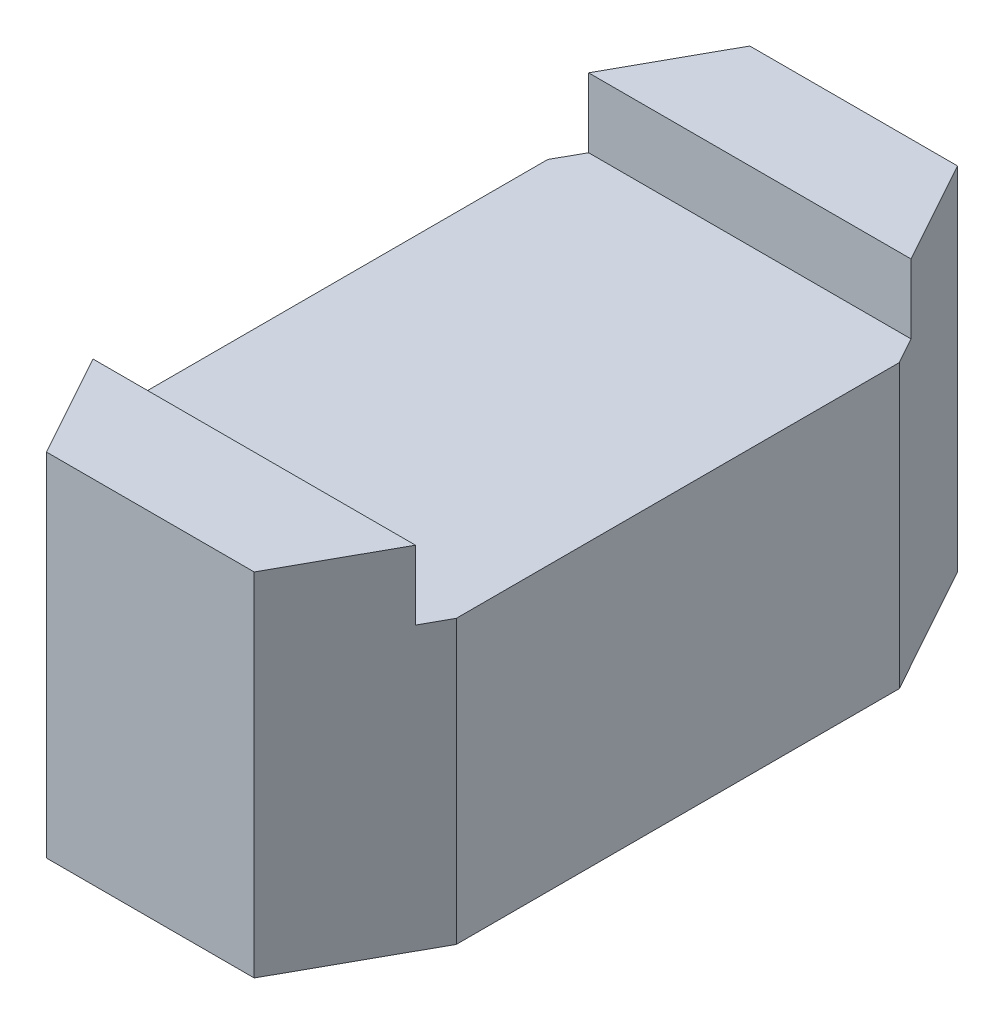
ISO-10303-21;
HEADER;
FILE_DESCRIPTION(('STEP AP214'),'2;1');
FILE_NAME('part.step','',(''),(''),'','','');
FILE_SCHEMA(('AUTOMOTIVE_DESIGN { 1 0 10303 214 1 1 1 1 }'));
ENDSEC;
DATA;
#1=APPLICATION_CONTEXT('core data for automotive mechanical design processes');
#2=APPLICATION_PROTOCOL_DEFINITION('international standard','automotive_design',2000,#1);
#3=PRODUCT_CONTEXT('',#1,'mechanical');
#4=PRODUCT('Part','Part','',(#3));
#5=PRODUCT_RELATED_PRODUCT_CATEGORY('part','',(#4));
#6=PRODUCT_DEFINITION_FORMATION('','',#4);
#7=PRODUCT_DEFINITION_CONTEXT('part definition',#1,'design');
#8=PRODUCT_DEFINITION('design','',#6,#7);
#9=PRODUCT_DEFINITION_SHAPE('','',#8);
#10=(LENGTH_UNIT() NAMED_UNIT(*) SI_UNIT(.MILLI.,.METRE.));
#11=(NAMED_UNIT(*) PLANE_ANGLE_UNIT() SI_UNIT($,.RADIAN.));
#12=(NAMED_UNIT(*) SI_UNIT($,.STERADIAN.) SOLID_ANGLE_UNIT());
#13=UNCERTAINTY_MEASURE_WITH_UNIT(LENGTH_MEASURE(1.E-05),#10,'distance_accuracy_value','');
#14=(GEOMETRIC_REPRESENTATION_CONTEXT(3) GLOBAL_UNCERTAINTY_ASSIGNED_CONTEXT((#13)) GLOBAL_UNIT_ASSIGNED_CONTEXT((#10,
#11,#12)) REPRESENTATION_CONTEXT('',''));
#15=CARTESIAN_POINT('',(0.,0.,0.));
#16=DIRECTION('',(0.,0.,1.));
#17=DIRECTION('',(1.,0.,0.));
#18=AXIS2_PLACEMENT_3D('',#15,#16,#17);
#19=CARTESIAN_POINT('',(-1.27,2.54,-1.6));
#20=DIRECTION('',(1.,0.,0.));
#21=DIRECTION('',(0.,0.,-1.));
#22=AXIS2_PLACEMENT_3D('',#19,#20,#21);
#23=PLANE('',#22);
#24=DIRECTION('',(0.,0.,1.));
#25=VECTOR('',#24,1.);
#26=CARTESIAN_POINT('',(-1.27,2.04,-1.79));
#27=LINE('',#26,#25);
#28=CARTESIAN_POINT('',(-1.27,2.04,-1.6));
#29=VERTEX_POINT('',#28);
#30=CARTESIAN_POINT('',(-1.27,2.04,1.6));
#31=VERTEX_POINT('',#30);
#32=EDGE_CURVE('E234',#29,#31,#27,.T.);
#33=ORIENTED_EDGE('',*,*,#32,.F.);
#34=DIRECTION('',(0.,-1.,0.));
#35=VECTOR('',#34,1.);
#36=CARTESIAN_POINT('',(-1.27,2.54,-1.6));
#37=LINE('',#36,#35);
#38=CARTESIAN_POINT('',(-1.27,0.,-1.6));
#39=VERTEX_POINT('',#38);
#40=EDGE_CURVE('E185',#29,#39,#37,.T.);
#41=ORIENTED_EDGE('',*,*,#40,.T.);
#42=DIRECTION('',(0.,0.,1.));
#43=VECTOR('',#42,1.);
#44=CARTESIAN_POINT('',(-1.27,0.,-1.6));
#45=LINE('',#44,#43);
#46=CARTESIAN_POINT('',(-1.27,0.,1.6));
#47=VERTEX_POINT('',#46);
#48=EDGE_CURVE('E165',#39,#47,#45,.T.);
#49=ORIENTED_EDGE('',*,*,#48,.T.);
#50=DIRECTION('',(0.,-1.,0.));
#51=VECTOR('',#50,1.);
#52=CARTESIAN_POINT('',(-1.27,2.54,1.6));
#53=LINE('',#52,#51);
#54=EDGE_CURVE('E183',#31,#47,#53,.T.);
#55=ORIENTED_EDGE('',*,*,#54,.F.);
#56=EDGE_LOOP('',(#33,#41,#49,#55));
#57=FACE_BOUND('',#56,.T.);
#58=ADVANCED_FACE('F35',(#57),#23,.F.);
#59=CARTESIAN_POINT('',(1.27,2.54,-1.6));
#60=DIRECTION('',(-1.,0.,0.));
#61=DIRECTION('',(0.,0.,1.));
#62=AXIS2_PLACEMENT_3D('',#59,#60,#61);
#63=PLANE('',#62);
#64=DIRECTION('',(0.,0.,-1.));
#65=VECTOR('',#64,1.);
#66=CARTESIAN_POINT('',(1.27,2.04,-1.79));
#67=LINE('',#66,#65);
#68=CARTESIAN_POINT('',(1.27,2.04,1.6));
#69=VERTEX_POINT('',#68);
#70=CARTESIAN_POINT('',(1.27,2.04,-1.6));
#71=VERTEX_POINT('',#70);
#72=EDGE_CURVE('E230',#69,#71,#67,.T.);
#73=ORIENTED_EDGE('',*,*,#72,.F.);
#74=DIRECTION('',(0.,-1.,0.));
#75=VECTOR('',#74,1.);
#76=CARTESIAN_POINT('',(1.27,2.54,1.6));
#77=LINE('',#76,#75);
#78=CARTESIAN_POINT('',(1.27,0.,1.6));
#79=VERTEX_POINT('',#78);
#80=EDGE_CURVE('E151',#69,#79,#77,.T.);
#81=ORIENTED_EDGE('',*,*,#80,.T.);
#82=DIRECTION('',(0.,0.,-1.));
#83=VECTOR('',#82,1.);
#84=CARTESIAN_POINT('',(1.27,0.,-1.6));
#85=LINE('',#84,#83);
#86=CARTESIAN_POINT('',(1.27,0.,-1.6));
#87=VERTEX_POINT('',#86);
#88=EDGE_CURVE('E175',#79,#87,#85,.T.);
#89=ORIENTED_EDGE('',*,*,#88,.T.);
#90=DIRECTION('',(0.,-1.,0.));
#91=VECTOR('',#90,1.);
#92=CARTESIAN_POINT('',(1.27,2.54,-1.6));
#93=LINE('',#92,#91);
#94=EDGE_CURVE('E93',#71,#87,#93,.T.);
#95=ORIENTED_EDGE('',*,*,#94,.F.);
#96=EDGE_LOOP('',(#73,#81,#89,#95));
#97=FACE_BOUND('',#96,.T.);
#98=ADVANCED_FACE('F249',(#97),#63,.F.);
#99=CARTESIAN_POINT('',(0.,2.54,0.));
#100=DIRECTION('',(0.,1.,0.));
#101=DIRECTION('',(0.,0.,1.));
#102=AXIS2_PLACEMENT_3D('',#99,#100,#101);
#103=PLANE('',#102);
#104=DIRECTION('',(-1.,0.,0.));
#105=VECTOR('',#104,1.);
#106=CARTESIAN_POINT('',(0.,2.54,-1.79));
#107=LINE('',#106,#105);
#108=CARTESIAN_POINT('',(1.16489361702128,2.54,-1.79));
#109=VERTEX_POINT('',#108);
#110=CARTESIAN_POINT('',(-1.16489361702128,2.54,-1.79));
#111=VERTEX_POINT('',#110);
#112=EDGE_CURVE('E11',#109,#111,#107,.T.);
#113=ORIENTED_EDGE('',*,*,#112,.F.);
#114=DIRECTION('',(-0.484061385167266,0.,-0.87503404241775));
#115=VECTOR('',#114,1.);
#116=CARTESIAN_POINT('',(0.75,2.54,-2.54));
#117=LINE('',#116,#115);
#118=CARTESIAN_POINT('',(0.75,2.54,-2.54));
#119=VERTEX_POINT('',#118);
#120=EDGE_CURVE('E101',#109,#119,#117,.T.);
#121=ORIENTED_EDGE('',*,*,#120,.T.);
#122=DIRECTION('',(-1.,0.,0.));
#123=VECTOR('',#122,1.);
#124=CARTESIAN_POINT('',(-0.75,2.54,-2.54));
#125=LINE('',#124,#123);
#126=CARTESIAN_POINT('',(-0.75,2.54,-2.54));
#127=VERTEX_POINT('',#126);
#128=EDGE_CURVE('E195',#119,#127,#125,.T.);
#129=ORIENTED_EDGE('',*,*,#128,.T.);
#130=DIRECTION('',(-0.484061385167266,0.,0.87503404241775));
#131=VECTOR('',#130,1.);
#132=CARTESIAN_POINT('',(-0.75,2.54,-2.54));
#133=LINE('',#132,#131);
#134=EDGE_CURVE('E211',#127,#111,#133,.T.);
#135=ORIENTED_EDGE('',*,*,#134,.T.);
#136=EDGE_LOOP('',(#113,#121,#129,#135));
#137=FACE_BOUND('',#136,.T.);
#138=ADVANCED_FACE('F253',(#137),#103,.T.);
#139=CARTESIAN_POINT('',(0.75,2.54,-2.54));
#140=DIRECTION('',(-0.87503404241775,0.,0.484061385167266));
#141=DIRECTION('',(0.484061385167266,0.,0.87503404241775));
#142=AXIS2_PLACEMENT_3D('',#139,#140,#141);
#143=PLANE('',#142);
#144=ORIENTED_EDGE('',*,*,#120,.F.);
#145=DIRECTION('',(0.,-1.,0.));
#146=VECTOR('',#145,1.);
#147=CARTESIAN_POINT('',(1.16489361702128,2.54,-1.79));
#148=LINE('',#147,#146);
#149=CARTESIAN_POINT('',(1.16489361702128,2.04,-1.79));
#150=VERTEX_POINT('',#149);
#151=EDGE_CURVE('E223',#109,#150,#148,.T.);
#152=ORIENTED_EDGE('',*,*,#151,.T.);
#153=DIRECTION('',(-0.484061385167266,0.,-0.87503404241775));
#154=VECTOR('',#153,1.);
#155=CARTESIAN_POINT('',(0.75,2.04,-2.54));
#156=LINE('',#155,#154);
#157=EDGE_CURVE('E160',#71,#150,#156,.T.);
#158=ORIENTED_EDGE('',*,*,#157,.F.);
#159=ORIENTED_EDGE('',*,*,#94,.T.);
#160=DIRECTION('',(-0.484061385167266,0.,-0.87503404241775));
#161=VECTOR('',#160,1.);
#162=CARTESIAN_POINT('',(0.75,0.,-2.54));
#163=LINE('',#162,#161);
#164=CARTESIAN_POINT('',(0.75,0.,-2.54));
#165=VERTEX_POINT('',#164);
#166=EDGE_CURVE('E157',#87,#165,#163,.T.);
#167=ORIENTED_EDGE('',*,*,#166,.T.);
#168=DIRECTION('',(0.,-1.,0.));
#169=VECTOR('',#168,1.);
#170=CARTESIAN_POINT('',(0.75,2.54,-2.54));
#171=LINE('',#170,#169);
#172=EDGE_CURVE('E138',#119,#165,#171,.T.);
#173=ORIENTED_EDGE('',*,*,#172,.F.);
#174=EDGE_LOOP('',(#144,#152,#158,#159,#167,#173));
#175=FACE_BOUND('',#174,.T.);
#176=ADVANCED_FACE('F37',(#175),#143,.F.);
#177=CARTESIAN_POINT('',(-0.75,2.54,-2.54));
#178=DIRECTION('',(0.,0.,1.));
#179=DIRECTION('',(1.,0.,0.));
#180=AXIS2_PLACEMENT_3D('',#177,#178,#179);
#181=PLANE('',#180);
#182=DIRECTION('',(-1.,0.,0.));
#183=VECTOR('',#182,1.);
#184=CARTESIAN_POINT('',(-0.75,0.,-2.54));
#185=LINE('',#184,#183);
#186=CARTESIAN_POINT('',(-0.75,0.,-2.54));
#187=VERTEX_POINT('',#186);
#188=EDGE_CURVE('E159',#165,#187,#185,.T.);
#189=ORIENTED_EDGE('',*,*,#188,.T.);
#190=DIRECTION('',(0.,-1.,0.));
#191=VECTOR('',#190,1.);
#192=CARTESIAN_POINT('',(-0.75,2.54,-2.54));
#193=LINE('',#192,#191);
#194=EDGE_CURVE('E187',#127,#187,#193,.T.);
#195=ORIENTED_EDGE('',*,*,#194,.F.);
#196=ORIENTED_EDGE('',*,*,#128,.F.);
#197=ORIENTED_EDGE('',*,*,#172,.T.);
#198=EDGE_LOOP('',(#189,#195,#196,#197));
#199=FACE_BOUND('',#198,.T.);
#200=ADVANCED_FACE('F193',(#199),#181,.F.);
#201=CARTESIAN_POINT('',(-0.75,2.54,-2.54));
#202=DIRECTION('',(0.87503404241775,0.,0.484061385167266));
#203=DIRECTION('',(0.484061385167266,0.,-0.87503404241775));
#204=AXIS2_PLACEMENT_3D('',#201,#202,#203);
#205=PLANE('',#204);
#206=DIRECTION('',(-0.484061385167266,0.,0.87503404241775));
#207=VECTOR('',#206,1.);
#208=CARTESIAN_POINT('',(-0.75,2.04,-2.54));
#209=LINE('',#208,#207);
#210=CARTESIAN_POINT('',(-1.16489361702128,2.04,-1.79));
#211=VERTEX_POINT('',#210);
#212=EDGE_CURVE('E218',#211,#29,#209,.T.);
#213=ORIENTED_EDGE('',*,*,#212,.F.);
#214=DIRECTION('',(0.,1.,0.));
#215=VECTOR('',#214,1.);
#216=CARTESIAN_POINT('',(-1.16489361702128,2.54,-1.79));
#217=LINE('',#216,#215);
#218=EDGE_CURVE('E212',#211,#111,#217,.T.);
#219=ORIENTED_EDGE('',*,*,#218,.T.);
#220=ORIENTED_EDGE('',*,*,#134,.F.);
#221=ORIENTED_EDGE('',*,*,#194,.T.);
#222=DIRECTION('',(-0.484061385167266,0.,0.87503404241775));
#223=VECTOR('',#222,1.);
#224=CARTESIAN_POINT('',(-0.75,0.,-2.54));
#225=LINE('',#224,#223);
#226=EDGE_CURVE('E162',#187,#39,#225,.T.);
#227=ORIENTED_EDGE('',*,*,#226,.T.);
#228=ORIENTED_EDGE('',*,*,#40,.F.);
#229=EDGE_LOOP('',(#213,#219,#220,#221,#227,#228));
#230=FACE_BOUND('',#229,.T.);
#231=ADVANCED_FACE('F207',(#230),#205,.F.);
#232=CARTESIAN_POINT('',(-1.27,2.54,1.6));
#233=DIRECTION('',(0.87503404241775,0.,-0.484061385167266));
#234=DIRECTION('',(-0.484061385167266,0.,-0.87503404241775));
#235=AXIS2_PLACEMENT_3D('',#232,#233,#234);
#236=PLANE('',#235);
#237=DIRECTION('',(0.484061385167266,0.,0.87503404241775));
#238=VECTOR('',#237,1.);
#239=CARTESIAN_POINT('',(-1.27,2.54,1.6));
#240=LINE('',#239,#238);
#241=CARTESIAN_POINT('',(-1.16489361702128,2.54,1.79));
#242=VERTEX_POINT('',#241);
#243=CARTESIAN_POINT('',(-0.75,2.54,2.54));
#244=VERTEX_POINT('',#243);
#245=EDGE_CURVE('E153',#242,#244,#240,.T.);
#246=ORIENTED_EDGE('',*,*,#245,.F.);
#247=DIRECTION('',(0.,-1.,0.));
#248=VECTOR('',#247,1.);
#249=CARTESIAN_POINT('',(-1.16489361702128,2.54,1.79));
#250=LINE('',#249,#248);
#251=CARTESIAN_POINT('',(-1.16489361702128,2.04,1.79));
#252=VERTEX_POINT('',#251);
#253=EDGE_CURVE('E50',#242,#252,#250,.T.);
#254=ORIENTED_EDGE('',*,*,#253,.T.);
#255=DIRECTION('',(0.484061385167266,0.,0.87503404241775));
#256=VECTOR('',#255,1.);
#257=CARTESIAN_POINT('',(-1.27,2.04,1.6));
#258=LINE('',#257,#256);
#259=EDGE_CURVE('E220',#31,#252,#258,.T.);
#260=ORIENTED_EDGE('',*,*,#259,.F.);
#261=ORIENTED_EDGE('',*,*,#54,.T.);
#262=DIRECTION('',(0.484061385167266,0.,0.87503404241775));
#263=VECTOR('',#262,1.);
#264=CARTESIAN_POINT('',(-1.27,0.,1.6));
#265=LINE('',#264,#263);
#266=CARTESIAN_POINT('',(-0.75,0.,2.54));
#267=VERTEX_POINT('',#266);
#268=EDGE_CURVE('E168',#47,#267,#265,.T.);
#269=ORIENTED_EDGE('',*,*,#268,.T.);
#270=DIRECTION('',(0.,-1.,0.));
#271=VECTOR('',#270,1.);
#272=CARTESIAN_POINT('',(-0.75,2.54,2.54));
#273=LINE('',#272,#271);
#274=EDGE_CURVE('E180',#244,#267,#273,.T.);
#275=ORIENTED_EDGE('',*,*,#274,.F.);
#276=EDGE_LOOP('',(#246,#254,#260,#261,#269,#275));
#277=FACE_BOUND('',#276,.T.);
#278=ADVANCED_FACE('F242',(#277),#236,.F.);
#279=CARTESIAN_POINT('',(-0.75,2.54,2.54));
#280=DIRECTION('',(0.,0.,-1.));
#281=DIRECTION('',(-1.,0.,0.));
#282=AXIS2_PLACEMENT_3D('',#279,#280,#281);
#283=PLANE('',#282);
#284=DIRECTION('',(1.,0.,0.));
#285=VECTOR('',#284,1.);
#286=CARTESIAN_POINT('',(-0.75,0.,2.54));
#287=LINE('',#286,#285);
#288=CARTESIAN_POINT('',(0.75,0.,2.54));
#289=VERTEX_POINT('',#288);
#290=EDGE_CURVE('E170',#267,#289,#287,.T.);
#291=ORIENTED_EDGE('',*,*,#290,.T.);
#292=DIRECTION('',(0.,-1.,0.));
#293=VECTOR('',#292,1.);
#294=CARTESIAN_POINT('',(0.75,2.54,2.54));
#295=LINE('',#294,#293);
#296=CARTESIAN_POINT('',(0.75,2.54,2.54));
#297=VERTEX_POINT('',#296);
#298=EDGE_CURVE('E178',#297,#289,#295,.T.);
#299=ORIENTED_EDGE('',*,*,#298,.F.);
#300=DIRECTION('',(1.,0.,0.));
#301=VECTOR('',#300,1.);
#302=CARTESIAN_POINT('',(-0.75,2.54,2.54));
#303=LINE('',#302,#301);
#304=EDGE_CURVE('E59',#244,#297,#303,.T.);
#305=ORIENTED_EDGE('',*,*,#304,.F.);
#306=ORIENTED_EDGE('',*,*,#274,.T.);
#307=EDGE_LOOP('',(#291,#299,#305,#306));
#308=FACE_BOUND('',#307,.T.);
#309=ADVANCED_FACE('F246',(#308),#283,.F.);
#310=CARTESIAN_POINT('',(1.27,2.54,1.6));
#311=DIRECTION('',(-0.875034042417749,0.,-0.484061385167266));
#312=DIRECTION('',(-0.484061385167266,0.,0.87503404241775));
#313=AXIS2_PLACEMENT_3D('',#310,#311,#312);
#314=PLANE('',#313);
#315=DIRECTION('',(0.484061385167266,0.,-0.87503404241775));
#316=VECTOR('',#315,1.);
#317=CARTESIAN_POINT('',(1.27,2.04,1.6));
#318=LINE('',#317,#316);
#319=CARTESIAN_POINT('',(1.16489361702128,2.04,1.79));
#320=VERTEX_POINT('',#319);
#321=EDGE_CURVE('E146',#320,#69,#318,.T.);
#322=ORIENTED_EDGE('',*,*,#321,.F.);
#323=DIRECTION('',(0.,1.,0.));
#324=VECTOR('',#323,1.);
#325=CARTESIAN_POINT('',(1.16489361702128,2.54,1.79));
#326=LINE('',#325,#324);
#327=CARTESIAN_POINT('',(1.16489361702128,2.54,1.79));
#328=VERTEX_POINT('',#327);
#329=EDGE_CURVE('E135',#320,#328,#326,.T.);
#330=ORIENTED_EDGE('',*,*,#329,.T.);
#331=DIRECTION('',(0.484061385167266,0.,-0.87503404241775));
#332=VECTOR('',#331,1.);
#333=CARTESIAN_POINT('',(1.27,2.54,1.6));
#334=LINE('',#333,#332);
#335=EDGE_CURVE('E144',#297,#328,#334,.T.);
#336=ORIENTED_EDGE('',*,*,#335,.F.);
#337=ORIENTED_EDGE('',*,*,#298,.T.);
#338=DIRECTION('',(0.484061385167266,0.,-0.87503404241775));
#339=VECTOR('',#338,1.);
#340=CARTESIAN_POINT('',(1.27,0.,1.6));
#341=LINE('',#340,#339);
#342=EDGE_CURVE('E172',#289,#79,#341,.T.);
#343=ORIENTED_EDGE('',*,*,#342,.T.);
#344=ORIENTED_EDGE('',*,*,#80,.F.);
#345=EDGE_LOOP('',(#322,#330,#336,#337,#343,#344));
#346=FACE_BOUND('',#345,.T.);
#347=ADVANCED_FACE('F142',(#346),#314,.F.);
#348=DIRECTION('',(1.,0.,0.));
#349=VECTOR('',#348,1.);
#350=CARTESIAN_POINT('',(0.,2.54,1.79));
#351=LINE('',#350,#349);
#352=EDGE_CURVE('E43',#242,#328,#351,.T.);
#353=ORIENTED_EDGE('',*,*,#352,.F.);
#354=ORIENTED_EDGE('',*,*,#245,.T.);
#355=ORIENTED_EDGE('',*,*,#304,.T.);
#356=ORIENTED_EDGE('',*,*,#335,.T.);
#357=EDGE_LOOP('',(#353,#354,#355,#356));
#358=FACE_BOUND('',#357,.T.);
#359=ADVANCED_FACE('F149',(#358),#103,.T.);
#360=CARTESIAN_POINT('',(0.,0.,0.));
#361=DIRECTION('',(0.,1.,0.));
#362=DIRECTION('',(0.,0.,1.));
#363=AXIS2_PLACEMENT_3D('',#360,#361,#362);
#364=PLANE('',#363);
#365=ORIENTED_EDGE('',*,*,#166,.F.);
#366=ORIENTED_EDGE('',*,*,#88,.F.);
#367=ORIENTED_EDGE('',*,*,#342,.F.);
#368=ORIENTED_EDGE('',*,*,#290,.F.);
#369=ORIENTED_EDGE('',*,*,#268,.F.);
#370=ORIENTED_EDGE('',*,*,#48,.F.);
#371=ORIENTED_EDGE('',*,*,#226,.F.);
#372=ORIENTED_EDGE('',*,*,#188,.F.);
#373=EDGE_LOOP('',(#365,#366,#367,#368,#369,#370,#371,#372));
#374=FACE_BOUND('',#373,.T.);
#375=ADVANCED_FACE('F199',(#374),#364,.F.);
#376=CARTESIAN_POINT('',(0.,2.04,0.));
#377=DIRECTION('',(0.,1.,0.));
#378=DIRECTION('',(0.,0.,1.));
#379=AXIS2_PLACEMENT_3D('',#376,#377,#378);
#380=PLANE('',#379);
#381=ORIENTED_EDGE('',*,*,#157,.T.);
#382=DIRECTION('',(-1.,0.,0.));
#383=VECTOR('',#382,1.);
#384=CARTESIAN_POINT('',(-1.27,2.04,-1.79));
#385=LINE('',#384,#383);
#386=EDGE_CURVE('E147',#150,#211,#385,.T.);
#387=ORIENTED_EDGE('',*,*,#386,.T.);
#388=ORIENTED_EDGE('',*,*,#212,.T.);
#389=ORIENTED_EDGE('',*,*,#32,.T.);
#390=ORIENTED_EDGE('',*,*,#259,.T.);
#391=DIRECTION('',(1.,0.,0.));
#392=VECTOR('',#391,1.);
#393=CARTESIAN_POINT('',(-1.27,2.04,1.79));
#394=LINE('',#393,#392);
#395=EDGE_CURVE('E232',#252,#320,#394,.T.);
#396=ORIENTED_EDGE('',*,*,#395,.T.);
#397=ORIENTED_EDGE('',*,*,#321,.T.);
#398=ORIENTED_EDGE('',*,*,#72,.T.);
#399=EDGE_LOOP('',(#381,#387,#388,#389,#390,#396,#397,#398));
#400=FACE_BOUND('',#399,.T.);
#401=ADVANCED_FACE('F238',(#400),#380,.T.);
#402=CARTESIAN_POINT('',(-1.27,2.04,-1.79));
#403=DIRECTION('',(0.,0.,-1.));
#404=DIRECTION('',(-1.,0.,0.));
#405=AXIS2_PLACEMENT_3D('',#402,#403,#404);
#406=PLANE('',#405);
#407=ORIENTED_EDGE('',*,*,#112,.T.);
#408=ORIENTED_EDGE('',*,*,#218,.F.);
#409=ORIENTED_EDGE('',*,*,#386,.F.);
#410=ORIENTED_EDGE('',*,*,#151,.F.);
#411=EDGE_LOOP('',(#407,#408,#409,#410));
#412=FACE_BOUND('',#411,.T.);
#413=ADVANCED_FACE('F252',(#412),#406,.F.);
#414=CARTESIAN_POINT('',(-1.27,2.04,1.79));
#415=DIRECTION('',(0.,0.,1.));
#416=DIRECTION('',(1.,0.,0.));
#417=AXIS2_PLACEMENT_3D('',#414,#415,#416);
#418=PLANE('',#417);
#419=ORIENTED_EDGE('',*,*,#352,.T.);
#420=ORIENTED_EDGE('',*,*,#329,.F.);
#421=ORIENTED_EDGE('',*,*,#395,.F.);
#422=ORIENTED_EDGE('',*,*,#253,.F.);
#423=EDGE_LOOP('',(#419,#420,#421,#422));
#424=FACE_BOUND('',#423,.T.);
#425=ADVANCED_FACE('F134',(#424),#418,.F.);
#426=CLOSED_SHELL('',(#58,#98,#138,#176,#200,#231,#278,#309,#347,#359,#375,#401,#413,#425));
#427=MANIFOLD_SOLID_BREP('B2',#426);
#428=ADVANCED_BREP_SHAPE_REPRESENTATION('',(#18,#427),#14);
#429=SHAPE_DEFINITION_REPRESENTATION(#9,#428);
ENDSEC;
END-ISO-10303-21;
